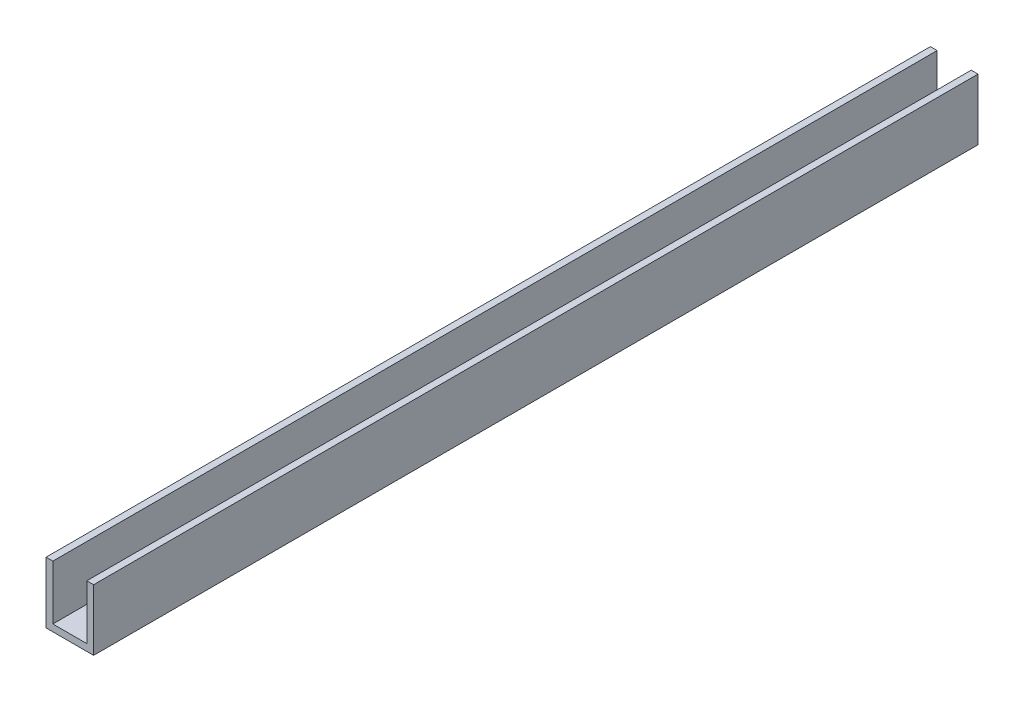
ISO-10303-21;
HEADER;
FILE_DESCRIPTION(('STEP AP214'),'2;1');
FILE_NAME('part.step','',(''),(''),'','','');
FILE_SCHEMA(('AUTOMOTIVE_DESIGN { 1 0 10303 214 1 1 1 1 }'));
ENDSEC;
DATA;
#1=APPLICATION_CONTEXT('core data for automotive mechanical design processes');
#2=APPLICATION_PROTOCOL_DEFINITION('international standard','automotive_design',2000,#1);
#3=PRODUCT_CONTEXT('',#1,'mechanical');
#4=PRODUCT('Part','Part','',(#3));
#5=PRODUCT_RELATED_PRODUCT_CATEGORY('part','',(#4));
#6=PRODUCT_DEFINITION_FORMATION('','',#4);
#7=PRODUCT_DEFINITION_CONTEXT('part definition',#1,'design');
#8=PRODUCT_DEFINITION('design','',#6,#7);
#9=PRODUCT_DEFINITION_SHAPE('','',#8);
#10=(LENGTH_UNIT() NAMED_UNIT(*) SI_UNIT(.MILLI.,.METRE.));
#11=(NAMED_UNIT(*) PLANE_ANGLE_UNIT() SI_UNIT($,.RADIAN.));
#12=(NAMED_UNIT(*) SI_UNIT($,.STERADIAN.) SOLID_ANGLE_UNIT());
#13=UNCERTAINTY_MEASURE_WITH_UNIT(LENGTH_MEASURE(1.E-05),#10,'distance_accuracy_value','');
#14=(GEOMETRIC_REPRESENTATION_CONTEXT(3) GLOBAL_UNCERTAINTY_ASSIGNED_CONTEXT((#13)) GLOBAL_UNIT_ASSIGNED_CONTEXT((#10,
#11,#12)) REPRESENTATION_CONTEXT('',''));
#15=CARTESIAN_POINT('',(0.,0.,0.));
#16=DIRECTION('',(0.,0.,1.));
#17=DIRECTION('',(1.,0.,0.));
#18=AXIS2_PLACEMENT_3D('',#15,#16,#17);
#19=CARTESIAN_POINT('',(3.5,0.,130.));
#20=DIRECTION('',(-1.,0.,0.));
#21=DIRECTION('',(0.,-1.,0.));
#22=AXIS2_PLACEMENT_3D('',#19,#20,#21);
#23=PLANE('',#22);
#24=DIRECTION('',(0.,1.,0.));
#25=VECTOR('',#24,1.);
#26=CARTESIAN_POINT('',(3.5,0.,0.));
#27=LINE('',#26,#25);
#28=CARTESIAN_POINT('',(3.5,0.,0.));
#29=VERTEX_POINT('',#28);
#30=CARTESIAN_POINT('',(3.5,9.,0.));
#31=VERTEX_POINT('',#30);
#32=EDGE_CURVE('E140',#29,#31,#27,.T.);
#33=ORIENTED_EDGE('',*,*,#32,.T.);
#34=DIRECTION('',(0.,0.,-1.));
#35=VECTOR('',#34,1.);
#36=CARTESIAN_POINT('',(3.5,9.,130.));
#37=LINE('',#36,#35);
#38=CARTESIAN_POINT('',(3.5,9.,130.));
#39=VERTEX_POINT('',#38);
#40=EDGE_CURVE('E11',#39,#31,#37,.T.);
#41=ORIENTED_EDGE('',*,*,#40,.F.);
#42=DIRECTION('',(0.,1.,0.));
#43=VECTOR('',#42,1.);
#44=CARTESIAN_POINT('',(3.5,0.,130.));
#45=LINE('',#44,#43);
#46=CARTESIAN_POINT('',(3.5,0.,130.));
#47=VERTEX_POINT('',#46);
#48=EDGE_CURVE('E162',#47,#39,#45,.T.);
#49=ORIENTED_EDGE('',*,*,#48,.F.);
#50=DIRECTION('',(0.,0.,-1.));
#51=VECTOR('',#50,1.);
#52=CARTESIAN_POINT('',(3.5,0.,130.));
#53=LINE('',#52,#51);
#54=EDGE_CURVE('E136',#47,#29,#53,.T.);
#55=ORIENTED_EDGE('',*,*,#54,.T.);
#56=EDGE_LOOP('',(#33,#41,#49,#55));
#57=FACE_BOUND('',#56,.T.);
#58=ADVANCED_FACE('F39',(#57),#23,.F.);
#59=CARTESIAN_POINT('',(3.5,9.,130.));
#60=DIRECTION('',(0.,-1.,0.));
#61=DIRECTION('',(0.,0.,-1.));
#62=AXIS2_PLACEMENT_3D('',#59,#60,#61);
#63=PLANE('',#62);
#64=DIRECTION('',(-1.,0.,0.));
#65=VECTOR('',#64,1.);
#66=CARTESIAN_POINT('',(3.5,9.,0.));
#67=LINE('',#66,#65);
#68=CARTESIAN_POINT('',(2.5,9.,0.));
#69=VERTEX_POINT('',#68);
#70=EDGE_CURVE('E144',#31,#69,#67,.T.);
#71=ORIENTED_EDGE('',*,*,#70,.T.);
#72=DIRECTION('',(0.,0.,-1.));
#73=VECTOR('',#72,1.);
#74=CARTESIAN_POINT('',(2.5,9.,130.));
#75=LINE('',#74,#73);
#76=CARTESIAN_POINT('',(2.5,9.,130.));
#77=VERTEX_POINT('',#76);
#78=EDGE_CURVE('E48',#77,#69,#75,.T.);
#79=ORIENTED_EDGE('',*,*,#78,.F.);
#80=DIRECTION('',(-1.,0.,0.));
#81=VECTOR('',#80,1.);
#82=CARTESIAN_POINT('',(3.5,9.,130.));
#83=LINE('',#82,#81);
#84=EDGE_CURVE('E99',#39,#77,#83,.T.);
#85=ORIENTED_EDGE('',*,*,#84,.F.);
#86=ORIENTED_EDGE('',*,*,#40,.T.);
#87=EDGE_LOOP('',(#71,#79,#85,#86));
#88=FACE_BOUND('',#87,.T.);
#89=ADVANCED_FACE('F208',(#88),#63,.F.);
#90=CARTESIAN_POINT('',(2.5,9.,130.));
#91=DIRECTION('',(1.,0.,0.));
#92=DIRECTION('',(0.,1.,0.));
#93=AXIS2_PLACEMENT_3D('',#90,#91,#92);
#94=PLANE('',#93);
#95=DIRECTION('',(0.,-1.,0.));
#96=VECTOR('',#95,1.);
#97=CARTESIAN_POINT('',(2.5,9.,0.));
#98=LINE('',#97,#96);
#99=CARTESIAN_POINT('',(2.5,1.,0.));
#100=VERTEX_POINT('',#99);
#101=EDGE_CURVE('E147',#69,#100,#98,.T.);
#102=ORIENTED_EDGE('',*,*,#101,.T.);
#103=DIRECTION('',(0.,0.,-1.));
#104=VECTOR('',#103,1.);
#105=CARTESIAN_POINT('',(2.5,1.,130.));
#106=LINE('',#105,#104);
#107=CARTESIAN_POINT('',(2.5,1.,130.));
#108=VERTEX_POINT('',#107);
#109=EDGE_CURVE('E173',#108,#100,#106,.T.);
#110=ORIENTED_EDGE('',*,*,#109,.F.);
#111=DIRECTION('',(0.,-1.,0.));
#112=VECTOR('',#111,1.);
#113=CARTESIAN_POINT('',(2.5,9.,130.));
#114=LINE('',#113,#112);
#115=EDGE_CURVE('E183',#77,#108,#114,.T.);
#116=ORIENTED_EDGE('',*,*,#115,.F.);
#117=ORIENTED_EDGE('',*,*,#78,.T.);
#118=EDGE_LOOP('',(#102,#110,#116,#117));
#119=FACE_BOUND('',#118,.T.);
#120=ADVANCED_FACE('F181',(#119),#94,.F.);
#121=CARTESIAN_POINT('',(2.5,1.,130.));
#122=DIRECTION('',(0.,-1.,0.));
#123=DIRECTION('',(1.,0.,0.));
#124=AXIS2_PLACEMENT_3D('',#121,#122,#123);
#125=PLANE('',#124);
#126=DIRECTION('',(-1.,0.,0.));
#127=VECTOR('',#126,1.);
#128=CARTESIAN_POINT('',(2.5,1.,0.));
#129=LINE('',#128,#127);
#130=CARTESIAN_POINT('',(-2.5,1.,0.));
#131=VERTEX_POINT('',#130);
#132=EDGE_CURVE('E150',#100,#131,#129,.T.);
#133=ORIENTED_EDGE('',*,*,#132,.T.);
#134=DIRECTION('',(0.,0.,-1.));
#135=VECTOR('',#134,1.);
#136=CARTESIAN_POINT('',(-2.5,1.,130.));
#137=LINE('',#136,#135);
#138=CARTESIAN_POINT('',(-2.5,1.,130.));
#139=VERTEX_POINT('',#138);
#140=EDGE_CURVE('E169',#139,#131,#137,.T.);
#141=ORIENTED_EDGE('',*,*,#140,.F.);
#142=DIRECTION('',(-1.,0.,0.));
#143=VECTOR('',#142,1.);
#144=CARTESIAN_POINT('',(2.5,1.,130.));
#145=LINE('',#144,#143);
#146=EDGE_CURVE('E196',#108,#139,#145,.T.);
#147=ORIENTED_EDGE('',*,*,#146,.F.);
#148=ORIENTED_EDGE('',*,*,#109,.T.);
#149=EDGE_LOOP('',(#133,#141,#147,#148));
#150=FACE_BOUND('',#149,.T.);
#151=ADVANCED_FACE('F191',(#150),#125,.F.);
#152=CARTESIAN_POINT('',(-2.5,9.,130.));
#153=DIRECTION('',(-1.,0.,0.));
#154=DIRECTION('',(0.,-1.,0.));
#155=AXIS2_PLACEMENT_3D('',#152,#153,#154);
#156=PLANE('',#155);
#157=DIRECTION('',(0.,1.,0.));
#158=VECTOR('',#157,1.);
#159=CARTESIAN_POINT('',(-2.5,9.,0.));
#160=LINE('',#159,#158);
#161=CARTESIAN_POINT('',(-2.5,9.,0.));
#162=VERTEX_POINT('',#161);
#163=EDGE_CURVE('E153',#131,#162,#160,.T.);
#164=ORIENTED_EDGE('',*,*,#163,.T.);
#165=DIRECTION('',(0.,0.,-1.));
#166=VECTOR('',#165,1.);
#167=CARTESIAN_POINT('',(-2.5,9.,130.));
#168=LINE('',#167,#166);
#169=CARTESIAN_POINT('',(-2.5,9.,130.));
#170=VERTEX_POINT('',#169);
#171=EDGE_CURVE('E129',#170,#162,#168,.T.);
#172=ORIENTED_EDGE('',*,*,#171,.F.);
#173=DIRECTION('',(0.,1.,0.));
#174=VECTOR('',#173,1.);
#175=CARTESIAN_POINT('',(-2.5,9.,130.));
#176=LINE('',#175,#174);
#177=EDGE_CURVE('E118',#139,#170,#176,.T.);
#178=ORIENTED_EDGE('',*,*,#177,.F.);
#179=ORIENTED_EDGE('',*,*,#140,.T.);
#180=EDGE_LOOP('',(#164,#172,#178,#179));
#181=FACE_BOUND('',#180,.T.);
#182=ADVANCED_FACE('F194',(#181),#156,.F.);
#183=CARTESIAN_POINT('',(-3.5,9.,130.));
#184=DIRECTION('',(0.,-1.,0.));
#185=DIRECTION('',(0.,0.,-1.));
#186=AXIS2_PLACEMENT_3D('',#183,#184,#185);
#187=PLANE('',#186);
#188=DIRECTION('',(-1.,0.,0.));
#189=VECTOR('',#188,1.);
#190=CARTESIAN_POINT('',(-3.5,9.,0.));
#191=LINE('',#190,#189);
#192=CARTESIAN_POINT('',(-3.5,9.,0.));
#193=VERTEX_POINT('',#192);
#194=EDGE_CURVE('E127',#162,#193,#191,.T.);
#195=ORIENTED_EDGE('',*,*,#194,.T.);
#196=DIRECTION('',(0.,0.,-1.));
#197=VECTOR('',#196,1.);
#198=CARTESIAN_POINT('',(-3.5,9.,130.));
#199=LINE('',#198,#197);
#200=CARTESIAN_POINT('',(-3.5,9.,130.));
#201=VERTEX_POINT('',#200);
#202=EDGE_CURVE('E124',#201,#193,#199,.T.);
#203=ORIENTED_EDGE('',*,*,#202,.F.);
#204=DIRECTION('',(-1.,0.,0.));
#205=VECTOR('',#204,1.);
#206=CARTESIAN_POINT('',(-3.5,9.,130.));
#207=LINE('',#206,#205);
#208=EDGE_CURVE('E112',#170,#201,#207,.T.);
#209=ORIENTED_EDGE('',*,*,#208,.F.);
#210=ORIENTED_EDGE('',*,*,#171,.T.);
#211=EDGE_LOOP('',(#195,#203,#209,#210));
#212=FACE_BOUND('',#211,.T.);
#213=ADVANCED_FACE('F125',(#212),#187,.F.);
#214=CARTESIAN_POINT('',(-3.5,0.,130.));
#215=DIRECTION('',(1.,0.,0.));
#216=DIRECTION('',(0.,1.,0.));
#217=AXIS2_PLACEMENT_3D('',#214,#215,#216);
#218=PLANE('',#217);
#219=DIRECTION('',(0.,-1.,0.));
#220=VECTOR('',#219,1.);
#221=CARTESIAN_POINT('',(-3.5,0.,0.));
#222=LINE('',#221,#220);
#223=CARTESIAN_POINT('',(-3.5,0.,0.));
#224=VERTEX_POINT('',#223);
#225=EDGE_CURVE('E85',#193,#224,#222,.T.);
#226=ORIENTED_EDGE('',*,*,#225,.T.);
#227=DIRECTION('',(0.,0.,-1.));
#228=VECTOR('',#227,1.);
#229=CARTESIAN_POINT('',(-3.5,0.,130.));
#230=LINE('',#229,#228);
#231=CARTESIAN_POINT('',(-3.5,0.,130.));
#232=VERTEX_POINT('',#231);
#233=EDGE_CURVE('E130',#232,#224,#230,.T.);
#234=ORIENTED_EDGE('',*,*,#233,.F.);
#235=DIRECTION('',(0.,-1.,0.));
#236=VECTOR('',#235,1.);
#237=CARTESIAN_POINT('',(-3.5,0.,130.));
#238=LINE('',#237,#236);
#239=EDGE_CURVE('E116',#201,#232,#238,.T.);
#240=ORIENTED_EDGE('',*,*,#239,.F.);
#241=ORIENTED_EDGE('',*,*,#202,.T.);
#242=EDGE_LOOP('',(#226,#234,#240,#241));
#243=FACE_BOUND('',#242,.T.);
#244=ADVANCED_FACE('F132',(#243),#218,.F.);
#245=CARTESIAN_POINT('',(-3.5,0.,130.));
#246=DIRECTION('',(0.,1.,0.));
#247=DIRECTION('',(0.,0.,1.));
#248=AXIS2_PLACEMENT_3D('',#245,#246,#247);
#249=PLANE('',#248);
#250=DIRECTION('',(1.,0.,0.));
#251=VECTOR('',#250,1.);
#252=CARTESIAN_POINT('',(-3.5,0.,0.));
#253=LINE('',#252,#251);
#254=EDGE_CURVE('E91',#224,#29,#253,.T.);
#255=ORIENTED_EDGE('',*,*,#254,.T.);
#256=ORIENTED_EDGE('',*,*,#54,.F.);
#257=DIRECTION('',(1.,0.,0.));
#258=VECTOR('',#257,1.);
#259=CARTESIAN_POINT('',(-3.5,0.,130.));
#260=LINE('',#259,#258);
#261=EDGE_CURVE('E56',#232,#47,#260,.T.);
#262=ORIENTED_EDGE('',*,*,#261,.F.);
#263=ORIENTED_EDGE('',*,*,#233,.T.);
#264=EDGE_LOOP('',(#255,#256,#262,#263));
#265=FACE_BOUND('',#264,.T.);
#266=ADVANCED_FACE('F224',(#265),#249,.F.);
#267=CARTESIAN_POINT('',(0.,0.,130.));
#268=DIRECTION('',(0.,0.,1.));
#269=DIRECTION('',(1.,0.,0.));
#270=AXIS2_PLACEMENT_3D('',#267,#268,#269);
#271=PLANE('',#270);
#272=ORIENTED_EDGE('',*,*,#48,.T.);
#273=ORIENTED_EDGE('',*,*,#84,.T.);
#274=ORIENTED_EDGE('',*,*,#115,.T.);
#275=ORIENTED_EDGE('',*,*,#146,.T.);
#276=ORIENTED_EDGE('',*,*,#177,.T.);
#277=ORIENTED_EDGE('',*,*,#208,.T.);
#278=ORIENTED_EDGE('',*,*,#239,.T.);
#279=ORIENTED_EDGE('',*,*,#261,.T.);
#280=EDGE_LOOP('',(#272,#273,#274,#275,#276,#277,#278,#279));
#281=FACE_BOUND('',#280,.T.);
#282=ADVANCED_FACE('F114',(#281),#271,.T.);
#283=CARTESIAN_POINT('',(0.,0.,0.));
#284=DIRECTION('',(0.,0.,1.));
#285=DIRECTION('',(1.,0.,0.));
#286=AXIS2_PLACEMENT_3D('',#283,#284,#285);
#287=PLANE('',#286);
#288=ORIENTED_EDGE('',*,*,#32,.F.);
#289=ORIENTED_EDGE('',*,*,#254,.F.);
#290=ORIENTED_EDGE('',*,*,#225,.F.);
#291=ORIENTED_EDGE('',*,*,#194,.F.);
#292=ORIENTED_EDGE('',*,*,#163,.F.);
#293=ORIENTED_EDGE('',*,*,#132,.F.);
#294=ORIENTED_EDGE('',*,*,#101,.F.);
#295=ORIENTED_EDGE('',*,*,#70,.F.);
#296=EDGE_LOOP('',(#288,#289,#290,#291,#292,#293,#294,#295));
#297=FACE_BOUND('',#296,.T.);
#298=ADVANCED_FACE('F187',(#297),#287,.F.);
#299=CLOSED_SHELL('',(#58,#89,#120,#151,#182,#213,#244,#266,#282,#298));
#300=MANIFOLD_SOLID_BREP('B2',#299);
#301=ADVANCED_BREP_SHAPE_REPRESENTATION('',(#18,#300),#14);
#302=SHAPE_DEFINITION_REPRESENTATION(#9,#301);
ENDSEC;
END-ISO-10303-21;
